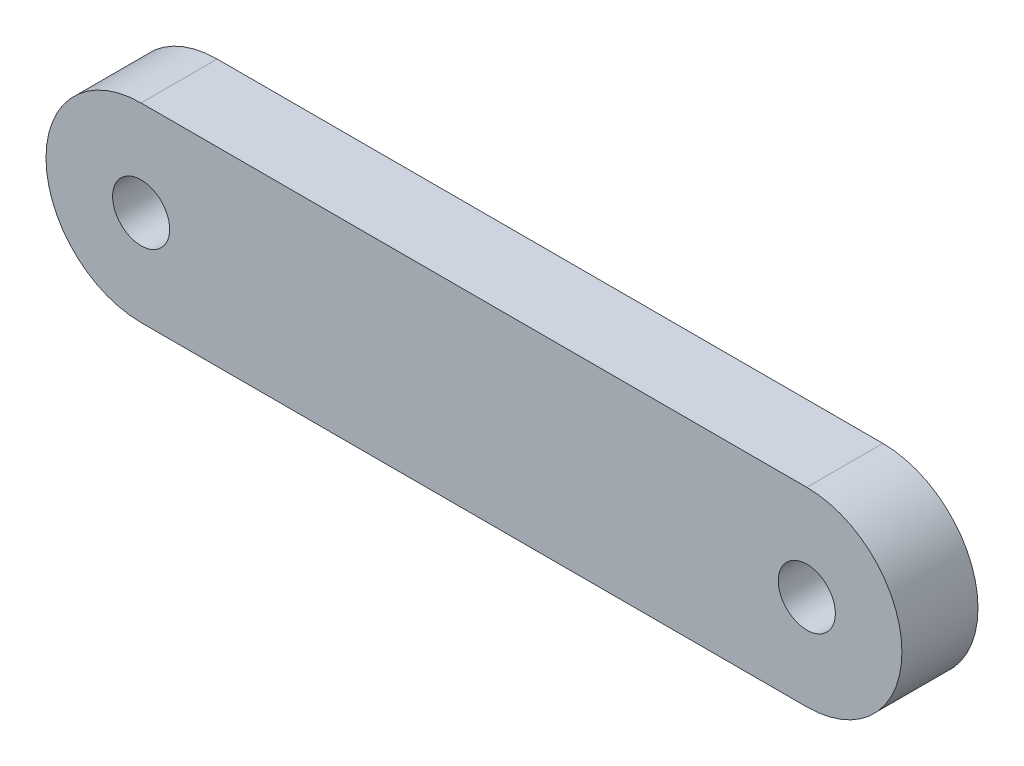
ISO-10303-21;
HEADER;
FILE_DESCRIPTION(('STEP AP214'),'2;1');
FILE_NAME('part.step','',(''),(''),'','','');
FILE_SCHEMA(('AUTOMOTIVE_DESIGN { 1 0 10303 214 1 1 1 1 }'));
ENDSEC;
DATA;
#1=APPLICATION_CONTEXT('core data for automotive mechanical design processes');
#2=APPLICATION_PROTOCOL_DEFINITION('international standard','automotive_design',2000,#1);
#3=PRODUCT_CONTEXT('',#1,'mechanical');
#4=PRODUCT('Part','Part','',(#3));
#5=PRODUCT_RELATED_PRODUCT_CATEGORY('part','',(#4));
#6=PRODUCT_DEFINITION_FORMATION('','',#4);
#7=PRODUCT_DEFINITION_CONTEXT('part definition',#1,'design');
#8=PRODUCT_DEFINITION('design','',#6,#7);
#9=PRODUCT_DEFINITION_SHAPE('','',#8);
#10=(LENGTH_UNIT() NAMED_UNIT(*) SI_UNIT(.MILLI.,.METRE.));
#11=(NAMED_UNIT(*) PLANE_ANGLE_UNIT() SI_UNIT($,.RADIAN.));
#12=(NAMED_UNIT(*) SI_UNIT($,.STERADIAN.) SOLID_ANGLE_UNIT());
#13=UNCERTAINTY_MEASURE_WITH_UNIT(LENGTH_MEASURE(1.E-05),#10,'distance_accuracy_value','');
#14=(GEOMETRIC_REPRESENTATION_CONTEXT(3) GLOBAL_UNCERTAINTY_ASSIGNED_CONTEXT((#13)) GLOBAL_UNIT_ASSIGNED_CONTEXT((#10,
#11,#12)) REPRESENTATION_CONTEXT('',''));
#15=CARTESIAN_POINT('',(0.,0.,0.));
#16=DIRECTION('',(0.,0.,1.));
#17=DIRECTION('',(1.,0.,0.));
#18=AXIS2_PLACEMENT_3D('',#15,#16,#17);
#19=CARTESIAN_POINT('',(-35.,0.,4.));
#20=DIRECTION('',(0.,0.,1.));
#21=DIRECTION('',(1.,0.,0.));
#22=AXIS2_PLACEMENT_3D('',#19,#20,#21);
#23=PLANE('',#22);
#24=CARTESIAN_POINT('',(-35.,0.,4.));
#25=DIRECTION('',(0.,0.,1.));
#26=DIRECTION('',(1.,0.,0.));
#27=AXIS2_PLACEMENT_3D('',#24,#25,#26);
#28=CIRCLE('',#27,1.5);
#29=CARTESIAN_POINT('',(-33.5,0.,4.));
#30=VERTEX_POINT('',#29);
#31=EDGE_CURVE('E105',#30,#30,#28,.T.);
#32=ORIENTED_EDGE('',*,*,#31,.F.);
#33=EDGE_LOOP('',(#32));
#34=FACE_BOUND('',#33,.T.);
#35=CARTESIAN_POINT('',(-35.,0.,4.));
#36=DIRECTION('',(0.,0.,1.));
#37=DIRECTION('',(1.,0.,0.));
#38=AXIS2_PLACEMENT_3D('',#35,#36,#37);
#39=CIRCLE('',#38,5.);
#40=CARTESIAN_POINT('',(-35.,5.,4.));
#41=VERTEX_POINT('',#40);
#42=CARTESIAN_POINT('',(-35.,-5.,4.));
#43=VERTEX_POINT('',#42);
#44=EDGE_CURVE('E90',#41,#43,#39,.T.);
#45=ORIENTED_EDGE('',*,*,#44,.T.);
#46=DIRECTION('',(1.,0.,0.));
#47=VECTOR('',#46,1.);
#48=CARTESIAN_POINT('',(-35.,-5.,4.));
#49=LINE('',#48,#47);
#50=CARTESIAN_POINT('',(0.,-5.,4.));
#51=VERTEX_POINT('',#50);
#52=EDGE_CURVE('E85',#43,#51,#49,.T.);
#53=ORIENTED_EDGE('',*,*,#52,.T.);
#54=CARTESIAN_POINT('',(0.,0.,4.));
#55=DIRECTION('',(0.,0.,1.));
#56=DIRECTION('',(1.,0.,0.));
#57=AXIS2_PLACEMENT_3D('',#54,#55,#56);
#58=CIRCLE('',#57,5.);
#59=CARTESIAN_POINT('',(0.,5.,4.));
#60=VERTEX_POINT('',#59);
#61=EDGE_CURVE('E88',#51,#60,#58,.T.);
#62=ORIENTED_EDGE('',*,*,#61,.T.);
#63=DIRECTION('',(-1.,0.,0.));
#64=VECTOR('',#63,1.);
#65=CARTESIAN_POINT('',(-35.,5.,4.));
#66=LINE('',#65,#64);
#67=EDGE_CURVE('E55',#60,#41,#66,.T.);
#68=ORIENTED_EDGE('',*,*,#67,.T.);
#69=EDGE_LOOP('',(#45,#53,#62,#68));
#70=FACE_BOUND('',#69,.T.);
#71=CARTESIAN_POINT('',(0.,0.,4.));
#72=DIRECTION('',(0.,0.,1.));
#73=DIRECTION('',(1.,0.,0.));
#74=AXIS2_PLACEMENT_3D('',#71,#72,#73);
#75=CIRCLE('',#74,1.5);
#76=CARTESIAN_POINT('',(1.5,0.,4.));
#77=VERTEX_POINT('',#76);
#78=EDGE_CURVE('E120',#77,#77,#75,.T.);
#79=ORIENTED_EDGE('',*,*,#78,.F.);
#80=EDGE_LOOP('',(#79));
#81=FACE_BOUND('',#80,.T.);
#82=ADVANCED_FACE('F38',(#34,#70,#81),#23,.T.);
#83=CARTESIAN_POINT('',(-35.,0.,0.));
#84=DIRECTION('',(0.,0.,1.));
#85=DIRECTION('',(1.,0.,0.));
#86=AXIS2_PLACEMENT_3D('',#83,#84,#85);
#87=PLANE('',#86);
#88=CARTESIAN_POINT('',(-35.,0.,0.));
#89=DIRECTION('',(0.,0.,1.));
#90=DIRECTION('',(1.,0.,0.));
#91=AXIS2_PLACEMENT_3D('',#88,#89,#90);
#92=CIRCLE('',#91,5.);
#93=CARTESIAN_POINT('',(-35.,5.,0.));
#94=VERTEX_POINT('',#93);
#95=CARTESIAN_POINT('',(-35.,-5.,0.));
#96=VERTEX_POINT('',#95);
#97=EDGE_CURVE('E102',#94,#96,#92,.T.);
#98=ORIENTED_EDGE('',*,*,#97,.F.);
#99=DIRECTION('',(-1.,0.,0.));
#100=VECTOR('',#99,1.);
#101=CARTESIAN_POINT('',(-35.,5.,0.));
#102=LINE('',#101,#100);
#103=CARTESIAN_POINT('',(0.,5.,0.));
#104=VERTEX_POINT('',#103);
#105=EDGE_CURVE('E78',#104,#94,#102,.T.);
#106=ORIENTED_EDGE('',*,*,#105,.F.);
#107=CARTESIAN_POINT('',(0.,0.,0.));
#108=DIRECTION('',(0.,0.,1.));
#109=DIRECTION('',(1.,0.,0.));
#110=AXIS2_PLACEMENT_3D('',#107,#108,#109);
#111=CIRCLE('',#110,5.);
#112=CARTESIAN_POINT('',(0.,-5.,0.));
#113=VERTEX_POINT('',#112);
#114=EDGE_CURVE('E72',#113,#104,#111,.T.);
#115=ORIENTED_EDGE('',*,*,#114,.F.);
#116=DIRECTION('',(1.,0.,0.));
#117=VECTOR('',#116,1.);
#118=CARTESIAN_POINT('',(-35.,-5.,0.));
#119=LINE('',#118,#117);
#120=EDGE_CURVE('E94',#96,#113,#119,.T.);
#121=ORIENTED_EDGE('',*,*,#120,.F.);
#122=EDGE_LOOP('',(#98,#106,#115,#121));
#123=FACE_BOUND('',#122,.T.);
#124=CARTESIAN_POINT('',(-35.,0.,0.));
#125=DIRECTION('',(0.,0.,1.));
#126=DIRECTION('',(1.,0.,0.));
#127=AXIS2_PLACEMENT_3D('',#124,#125,#126);
#128=CIRCLE('',#127,1.5);
#129=CARTESIAN_POINT('',(-33.5,0.,0.));
#130=VERTEX_POINT('',#129);
#131=EDGE_CURVE('E117',#130,#130,#128,.T.);
#132=ORIENTED_EDGE('',*,*,#131,.T.);
#133=EDGE_LOOP('',(#132));
#134=FACE_BOUND('',#133,.T.);
#135=CARTESIAN_POINT('',(0.,0.,0.));
#136=DIRECTION('',(0.,0.,1.));
#137=DIRECTION('',(1.,0.,0.));
#138=AXIS2_PLACEMENT_3D('',#135,#136,#137);
#139=CIRCLE('',#138,1.5);
#140=CARTESIAN_POINT('',(1.5,0.,0.));
#141=VERTEX_POINT('',#140);
#142=EDGE_CURVE('E123',#141,#141,#139,.T.);
#143=ORIENTED_EDGE('',*,*,#142,.T.);
#144=EDGE_LOOP('',(#143));
#145=FACE_BOUND('',#144,.T.);
#146=ADVANCED_FACE('F113',(#123,#134,#145),#87,.F.);
#147=CARTESIAN_POINT('',(-35.,0.,4.));
#148=DIRECTION('',(0.,0.,-1.));
#149=DIRECTION('',(-1.,0.,0.));
#150=AXIS2_PLACEMENT_3D('',#147,#148,#149);
#151=CYLINDRICAL_SURFACE('',#150,5.);
#152=ORIENTED_EDGE('',*,*,#97,.T.);
#153=DIRECTION('',(0.,0.,-1.));
#154=VECTOR('',#153,1.);
#155=CARTESIAN_POINT('',(-35.,-5.,4.));
#156=LINE('',#155,#154);
#157=EDGE_CURVE('E11',#43,#96,#156,.T.);
#158=ORIENTED_EDGE('',*,*,#157,.F.);
#159=ORIENTED_EDGE('',*,*,#44,.F.);
#160=DIRECTION('',(0.,0.,-1.));
#161=VECTOR('',#160,1.);
#162=CARTESIAN_POINT('',(-35.,5.,4.));
#163=LINE('',#162,#161);
#164=EDGE_CURVE('E98',#41,#94,#163,.T.);
#165=ORIENTED_EDGE('',*,*,#164,.T.);
#166=EDGE_LOOP('',(#152,#158,#159,#165));
#167=FACE_BOUND('',#166,.T.);
#168=ADVANCED_FACE('F40',(#167),#151,.T.);
#169=CARTESIAN_POINT('',(-35.,-5.,4.));
#170=DIRECTION('',(0.,1.,0.));
#171=DIRECTION('',(0.,0.,1.));
#172=AXIS2_PLACEMENT_3D('',#169,#170,#171);
#173=PLANE('',#172);
#174=ORIENTED_EDGE('',*,*,#120,.T.);
#175=DIRECTION('',(0.,0.,-1.));
#176=VECTOR('',#175,1.);
#177=CARTESIAN_POINT('',(0.,-5.,4.));
#178=LINE('',#177,#176);
#179=EDGE_CURVE('E47',#51,#113,#178,.T.);
#180=ORIENTED_EDGE('',*,*,#179,.F.);
#181=ORIENTED_EDGE('',*,*,#52,.F.);
#182=ORIENTED_EDGE('',*,*,#157,.T.);
#183=EDGE_LOOP('',(#174,#180,#181,#182));
#184=FACE_BOUND('',#183,.T.);
#185=ADVANCED_FACE('F93',(#184),#173,.F.);
#186=CARTESIAN_POINT('',(0.,0.,4.));
#187=DIRECTION('',(0.,0.,-1.));
#188=DIRECTION('',(-1.,0.,0.));
#189=AXIS2_PLACEMENT_3D('',#186,#187,#188);
#190=CYLINDRICAL_SURFACE('',#189,5.);
#191=ORIENTED_EDGE('',*,*,#114,.T.);
#192=DIRECTION('',(0.,0.,-1.));
#193=VECTOR('',#192,1.);
#194=CARTESIAN_POINT('',(0.,5.,4.));
#195=LINE('',#194,#193);
#196=EDGE_CURVE('E95',#60,#104,#195,.T.);
#197=ORIENTED_EDGE('',*,*,#196,.F.);
#198=ORIENTED_EDGE('',*,*,#61,.F.);
#199=ORIENTED_EDGE('',*,*,#179,.T.);
#200=EDGE_LOOP('',(#191,#197,#198,#199));
#201=FACE_BOUND('',#200,.T.);
#202=ADVANCED_FACE('F96',(#201),#190,.T.);
#203=CARTESIAN_POINT('',(-35.,5.,4.));
#204=DIRECTION('',(0.,-1.,0.));
#205=DIRECTION('',(0.,0.,-1.));
#206=AXIS2_PLACEMENT_3D('',#203,#204,#205);
#207=PLANE('',#206);
#208=ORIENTED_EDGE('',*,*,#105,.T.);
#209=ORIENTED_EDGE('',*,*,#164,.F.);
#210=ORIENTED_EDGE('',*,*,#67,.F.);
#211=ORIENTED_EDGE('',*,*,#196,.T.);
#212=EDGE_LOOP('',(#208,#209,#210,#211));
#213=FACE_BOUND('',#212,.T.);
#214=ADVANCED_FACE('F110',(#213),#207,.F.);
#215=CARTESIAN_POINT('',(-35.,0.,4.));
#216=DIRECTION('',(0.,0.,-1.));
#217=DIRECTION('',(-1.,0.,0.));
#218=AXIS2_PLACEMENT_3D('',#215,#216,#217);
#219=CYLINDRICAL_SURFACE('',#218,1.5);
#220=ORIENTED_EDGE('',*,*,#31,.T.);
#221=EDGE_LOOP('',(#220));
#222=FACE_BOUND('',#221,.T.);
#223=ORIENTED_EDGE('',*,*,#131,.F.);
#224=EDGE_LOOP('',(#223));
#225=FACE_BOUND('',#224,.T.);
#226=ADVANCED_FACE('F140',(#222,#225),#219,.F.);
#227=CARTESIAN_POINT('',(0.,0.,4.));
#228=DIRECTION('',(0.,0.,-1.));
#229=DIRECTION('',(-1.,0.,0.));
#230=AXIS2_PLACEMENT_3D('',#227,#228,#229);
#231=CYLINDRICAL_SURFACE('',#230,1.5);
#232=ORIENTED_EDGE('',*,*,#78,.T.);
#233=EDGE_LOOP('',(#232));
#234=FACE_BOUND('',#233,.T.);
#235=ORIENTED_EDGE('',*,*,#142,.F.);
#236=EDGE_LOOP('',(#235));
#237=FACE_BOUND('',#236,.T.);
#238=ADVANCED_FACE('F129',(#234,#237),#231,.F.);
#239=CLOSED_SHELL('',(#82,#146,#168,#185,#202,#214,#226,#238));
#240=MANIFOLD_SOLID_BREP('B2',#239);
#241=ADVANCED_BREP_SHAPE_REPRESENTATION('',(#18,#240),#14);
#242=SHAPE_DEFINITION_REPRESENTATION(#9,#241);
ENDSEC;
END-ISO-10303-21;
